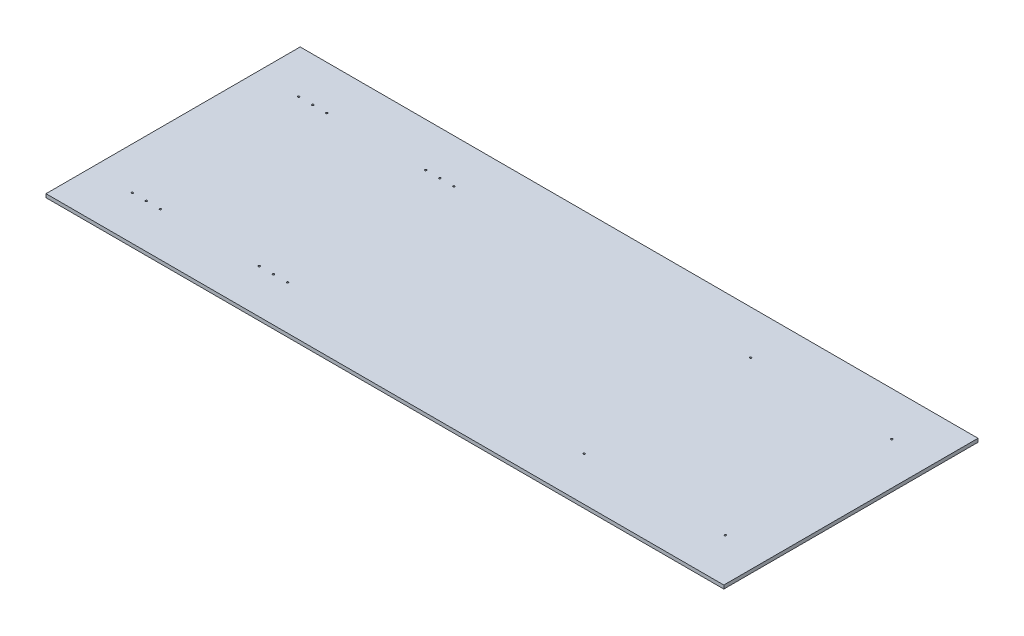
ISO-10303-21;
HEADER;
FILE_DESCRIPTION(('STEP AP214'),'2;1');
FILE_NAME('part.step','',(''),(''),'','','');
FILE_SCHEMA(('AUTOMOTIVE_DESIGN { 1 0 10303 214 1 1 1 1 }'));
ENDSEC;
DATA;
#1=APPLICATION_CONTEXT('core data for automotive mechanical design processes');
#2=APPLICATION_PROTOCOL_DEFINITION('international standard','automotive_design',2000,#1);
#3=PRODUCT_CONTEXT('',#1,'mechanical');
#4=PRODUCT('Part','Part','',(#3));
#5=PRODUCT_RELATED_PRODUCT_CATEGORY('part','',(#4));
#6=PRODUCT_DEFINITION_FORMATION('','',#4);
#7=PRODUCT_DEFINITION_CONTEXT('part definition',#1,'design');
#8=PRODUCT_DEFINITION('design','',#6,#7);
#9=PRODUCT_DEFINITION_SHAPE('','',#8);
#10=(LENGTH_UNIT() NAMED_UNIT(*) SI_UNIT(.MILLI.,.METRE.));
#11=(NAMED_UNIT(*) PLANE_ANGLE_UNIT() SI_UNIT($,.RADIAN.));
#12=(NAMED_UNIT(*) SI_UNIT($,.STERADIAN.) SOLID_ANGLE_UNIT());
#13=UNCERTAINTY_MEASURE_WITH_UNIT(LENGTH_MEASURE(1.E-05),#10,'distance_accuracy_value','');
#14=(GEOMETRIC_REPRESENTATION_CONTEXT(3) GLOBAL_UNCERTAINTY_ASSIGNED_CONTEXT((#13)) GLOBAL_UNIT_ASSIGNED_CONTEXT((#10,
#11,#12)) REPRESENTATION_CONTEXT('',''));
#15=CARTESIAN_POINT('',(0.,0.,0.));
#16=DIRECTION('',(0.,0.,1.));
#17=DIRECTION('',(1.,0.,0.));
#18=AXIS2_PLACEMENT_3D('',#15,#16,#17);
#19=CARTESIAN_POINT('',(-69.6693001407312,6.35,-431.310979244188));
#20=DIRECTION('',(1.,0.,0.));
#21=DIRECTION('',(0.,0.,-1.));
#22=AXIS2_PLACEMENT_3D('',#19,#20,#21);
#23=PLANE('',#22);
#24=DIRECTION('',(0.,0.,1.));
#25=VECTOR('',#24,1.);
#26=CARTESIAN_POINT('',(-69.6693001407312,0.,-431.310979244188));
#27=LINE('',#26,#25);
#28=CARTESIAN_POINT('',(-69.6693001407312,0.,-431.310979244188));
#29=VERTEX_POINT('',#28);
#30=CARTESIAN_POINT('',(-69.6693001407311,0.,25.8890207558125));
#31=VERTEX_POINT('',#30);
#32=EDGE_CURVE('E115',#29,#31,#27,.T.);
#33=ORIENTED_EDGE('',*,*,#32,.T.);
#34=DIRECTION('',(0.,-1.,0.));
#35=VECTOR('',#34,1.);
#36=CARTESIAN_POINT('',(-69.6693001407311,6.35,25.8890207558125));
#37=LINE('',#36,#35);
#38=CARTESIAN_POINT('',(-69.6693001407311,6.35,25.8890207558125));
#39=VERTEX_POINT('',#38);
#40=EDGE_CURVE('E11',#39,#31,#37,.T.);
#41=ORIENTED_EDGE('',*,*,#40,.F.);
#42=DIRECTION('',(0.,0.,1.));
#43=VECTOR('',#42,1.);
#44=CARTESIAN_POINT('',(-69.6693001407312,6.35,-431.310979244188));
#45=LINE('',#44,#43);
#46=CARTESIAN_POINT('',(-69.6693001407312,6.35,-431.310979244188));
#47=VERTEX_POINT('',#46);
#48=EDGE_CURVE('E98',#47,#39,#45,.T.);
#49=ORIENTED_EDGE('',*,*,#48,.F.);
#50=DIRECTION('',(0.,-1.,0.));
#51=VECTOR('',#50,1.);
#52=CARTESIAN_POINT('',(-69.6693001407312,6.35,-431.310979244188));
#53=LINE('',#52,#51);
#54=EDGE_CURVE('E111',#47,#29,#53,.T.);
#55=ORIENTED_EDGE('',*,*,#54,.T.);
#56=EDGE_LOOP('',(#33,#41,#49,#55));
#57=FACE_BOUND('',#56,.T.);
#58=ADVANCED_FACE('F40',(#57),#23,.F.);
#59=CARTESIAN_POINT('',(-69.6693001407311,6.35,25.8890207558125));
#60=DIRECTION('',(0.,0.,-1.));
#61=DIRECTION('',(-1.,0.,0.));
#62=AXIS2_PLACEMENT_3D('',#59,#60,#61);
#63=PLANE('',#62);
#64=DIRECTION('',(1.,0.,0.));
#65=VECTOR('',#64,1.);
#66=CARTESIAN_POINT('',(-69.6693001407311,0.,25.8890207558125));
#67=LINE('',#66,#65);
#68=CARTESIAN_POINT('',(1149.53069985927,0.,25.8890207558125));
#69=VERTEX_POINT('',#68);
#70=EDGE_CURVE('E103',#31,#69,#67,.T.);
#71=ORIENTED_EDGE('',*,*,#70,.T.);
#72=DIRECTION('',(0.,-1.,0.));
#73=VECTOR('',#72,1.);
#74=CARTESIAN_POINT('',(1149.53069985927,6.35,25.8890207558125));
#75=LINE('',#74,#73);
#76=CARTESIAN_POINT('',(1149.53069985927,6.35,25.8890207558125));
#77=VERTEX_POINT('',#76);
#78=EDGE_CURVE('E49',#77,#69,#75,.T.);
#79=ORIENTED_EDGE('',*,*,#78,.F.);
#80=DIRECTION('',(1.,0.,0.));
#81=VECTOR('',#80,1.);
#82=CARTESIAN_POINT('',(-69.6693001407311,6.35,25.8890207558125));
#83=LINE('',#82,#81);
#84=EDGE_CURVE('E93',#39,#77,#83,.T.);
#85=ORIENTED_EDGE('',*,*,#84,.F.);
#86=ORIENTED_EDGE('',*,*,#40,.T.);
#87=EDGE_LOOP('',(#71,#79,#85,#86));
#88=FACE_BOUND('',#87,.T.);
#89=ADVANCED_FACE('F102',(#88),#63,.F.);
#90=CARTESIAN_POINT('',(1149.53069985927,6.35,-431.310979244188));
#91=DIRECTION('',(-1.,0.,0.));
#92=DIRECTION('',(0.,0.,1.));
#93=AXIS2_PLACEMENT_3D('',#90,#91,#92);
#94=PLANE('',#93);
#95=DIRECTION('',(0.,0.,-1.));
#96=VECTOR('',#95,1.);
#97=CARTESIAN_POINT('',(1149.53069985927,0.,-431.310979244188));
#98=LINE('',#97,#96);
#99=CARTESIAN_POINT('',(1149.53069985927,0.,-431.310979244188));
#100=VERTEX_POINT('',#99);
#101=EDGE_CURVE('E78',#69,#100,#98,.T.);
#102=ORIENTED_EDGE('',*,*,#101,.T.);
#103=DIRECTION('',(0.,-1.,0.));
#104=VECTOR('',#103,1.);
#105=CARTESIAN_POINT('',(1149.53069985927,6.35,-431.310979244188));
#106=LINE('',#105,#104);
#107=CARTESIAN_POINT('',(1149.53069985927,6.35,-431.310979244188));
#108=VERTEX_POINT('',#107);
#109=EDGE_CURVE('E105',#108,#100,#106,.T.);
#110=ORIENTED_EDGE('',*,*,#109,.F.);
#111=DIRECTION('',(0.,0.,-1.));
#112=VECTOR('',#111,1.);
#113=CARTESIAN_POINT('',(1149.53069985927,6.35,-431.310979244188));
#114=LINE('',#113,#112);
#115=EDGE_CURVE('E96',#77,#108,#114,.T.);
#116=ORIENTED_EDGE('',*,*,#115,.F.);
#117=ORIENTED_EDGE('',*,*,#78,.T.);
#118=EDGE_LOOP('',(#102,#110,#116,#117));
#119=FACE_BOUND('',#118,.T.);
#120=ADVANCED_FACE('F106',(#119),#94,.F.);
#121=CARTESIAN_POINT('',(-69.6693001407312,6.35,-431.310979244188));
#122=DIRECTION('',(0.,0.,1.));
#123=DIRECTION('',(1.,0.,0.));
#124=AXIS2_PLACEMENT_3D('',#121,#122,#123);
#125=PLANE('',#124);
#126=DIRECTION('',(-1.,0.,0.));
#127=VECTOR('',#126,1.);
#128=CARTESIAN_POINT('',(-69.6693001407312,0.,-431.310979244188));
#129=LINE('',#128,#127);
#130=EDGE_CURVE('E86',#100,#29,#129,.T.);
#131=ORIENTED_EDGE('',*,*,#130,.T.);
#132=ORIENTED_EDGE('',*,*,#54,.F.);
#133=DIRECTION('',(-1.,0.,0.));
#134=VECTOR('',#133,1.);
#135=CARTESIAN_POINT('',(-69.6693001407312,6.35,-431.310979244188));
#136=LINE('',#135,#134);
#137=EDGE_CURVE('E59',#108,#47,#136,.T.);
#138=ORIENTED_EDGE('',*,*,#137,.F.);
#139=ORIENTED_EDGE('',*,*,#109,.T.);
#140=EDGE_LOOP('',(#131,#132,#138,#139));
#141=FACE_BOUND('',#140,.T.);
#142=ADVANCED_FACE('F128',(#141),#125,.F.);
#143=CARTESIAN_POINT('',(0.,6.35,0.));
#144=DIRECTION('',(0.,1.,0.));
#145=DIRECTION('',(0.,0.,1.));
#146=AXIS2_PLACEMENT_3D('',#143,#144,#145);
#147=PLANE('',#146);
#148=CARTESIAN_POINT('',(31.9306998592688,6.34999999999999,-53.0541792441876));
#149=DIRECTION('',(0.,-1.,0.));
#150=DIRECTION('',(0.,0.,-1.));
#151=AXIS2_PLACEMENT_3D('',#148,#149,#150);
#152=CIRCLE('',#151,1.63194999999999);
#153=CARTESIAN_POINT('',(31.9306998592688,6.34999999999999,-54.6861292441876));
#154=VERTEX_POINT('',#153);
#155=EDGE_CURVE('E313',#154,#154,#152,.T.);
#156=ORIENTED_EDGE('',*,*,#155,.T.);
#157=EDGE_LOOP('',(#156));
#158=FACE_BOUND('',#157,.T.);
#159=CARTESIAN_POINT('',(57.3306998592688,6.34999999999999,-53.0541792441876));
#160=DIRECTION('',(0.,-1.,0.));
#161=DIRECTION('',(0.,0.,-1.));
#162=AXIS2_PLACEMENT_3D('',#159,#160,#161);
#163=CIRCLE('',#162,1.63194999999999);
#164=CARTESIAN_POINT('',(57.3306998592688,6.34999999999999,-54.6861292441876));
#165=VERTEX_POINT('',#164);
#166=EDGE_CURVE('E301',#165,#165,#163,.T.);
#167=ORIENTED_EDGE('',*,*,#166,.T.);
#168=EDGE_LOOP('',(#167));
#169=FACE_BOUND('',#168,.T.);
#170=CARTESIAN_POINT('',(260.464546847095,6.35,-53.0541792441876));
#171=DIRECTION('',(0.,-1.,0.));
#172=DIRECTION('',(0.,0.,-1.));
#173=AXIS2_PLACEMENT_3D('',#170,#171,#172);
#174=CIRCLE('',#173,1.63194999999999);
#175=CARTESIAN_POINT('',(260.464546847095,6.35,-54.6861292441876));
#176=VERTEX_POINT('',#175);
#177=EDGE_CURVE('E289',#176,#176,#174,.T.);
#178=ORIENTED_EDGE('',*,*,#177,.T.);
#179=EDGE_LOOP('',(#178));
#180=FACE_BOUND('',#179,.T.);
#181=CARTESIAN_POINT('',(285.864546847095,6.35,-53.0541792441876));
#182=DIRECTION('',(0.,-1.,0.));
#183=DIRECTION('',(0.,0.,-1.));
#184=AXIS2_PLACEMENT_3D('',#181,#182,#183);
#185=CIRCLE('',#184,1.63194999999999);
#186=CARTESIAN_POINT('',(285.864546847095,6.35,-54.6861292441876));
#187=VERTEX_POINT('',#186);
#188=EDGE_CURVE('E277',#187,#187,#185,.T.);
#189=ORIENTED_EDGE('',*,*,#188,.T.);
#190=EDGE_LOOP('',(#189));
#191=FACE_BOUND('',#190,.T.);
#192=CARTESIAN_POINT('',(260.464546847095,6.35,-352.367779244188));
#193=DIRECTION('',(0.,-1.,0.));
#194=DIRECTION('',(0.,0.,-1.));
#195=AXIS2_PLACEMENT_3D('',#192,#193,#194);
#196=CIRCLE('',#195,1.63194999999999);
#197=CARTESIAN_POINT('',(260.464546847095,6.35,-353.999729244188));
#198=VERTEX_POINT('',#197);
#199=EDGE_CURVE('E265',#198,#198,#196,.T.);
#200=ORIENTED_EDGE('',*,*,#199,.T.);
#201=EDGE_LOOP('',(#200));
#202=FACE_BOUND('',#201,.T.);
#203=CARTESIAN_POINT('',(285.864546847095,6.35,-352.367779244188));
#204=DIRECTION('',(0.,-1.,0.));
#205=DIRECTION('',(0.,0.,-1.));
#206=AXIS2_PLACEMENT_3D('',#203,#204,#205);
#207=CIRCLE('',#206,1.63194999999999);
#208=CARTESIAN_POINT('',(285.864546847095,6.35,-353.999729244188));
#209=VERTEX_POINT('',#208);
#210=EDGE_CURVE('E253',#209,#209,#207,.T.);
#211=ORIENTED_EDGE('',*,*,#210,.T.);
#212=EDGE_LOOP('',(#211));
#213=FACE_BOUND('',#212,.T.);
#214=CARTESIAN_POINT('',(31.9306998592688,6.34999999999999,-352.367779244188));
#215=DIRECTION('',(0.,-1.,0.));
#216=DIRECTION('',(0.,0.,-1.));
#217=AXIS2_PLACEMENT_3D('',#214,#215,#216);
#218=CIRCLE('',#217,1.63194999999999);
#219=CARTESIAN_POINT('',(31.9306998592688,6.34999999999999,-353.999729244188));
#220=VERTEX_POINT('',#219);
#221=EDGE_CURVE('E241',#220,#220,#218,.T.);
#222=ORIENTED_EDGE('',*,*,#221,.T.);
#223=EDGE_LOOP('',(#222));
#224=FACE_BOUND('',#223,.T.);
#225=CARTESIAN_POINT('',(57.3306998592688,6.34999999999999,-352.367779244188));
#226=DIRECTION('',(0.,-1.,0.));
#227=DIRECTION('',(0.,0.,-1.));
#228=AXIS2_PLACEMENT_3D('',#225,#226,#227);
#229=CIRCLE('',#228,1.63194999999999);
#230=CARTESIAN_POINT('',(57.3306998592688,6.34999999999999,-353.999729244188));
#231=VERTEX_POINT('',#230);
#232=EDGE_CURVE('E230',#231,#231,#229,.T.);
#233=ORIENTED_EDGE('',*,*,#232,.T.);
#234=EDGE_LOOP('',(#233));
#235=FACE_BOUND('',#234,.T.);
#236=CARTESIAN_POINT('',(1073.33069985927,6.34999999999999,-53.0541792441876));
#237=DIRECTION('',(0.,-1.,0.));
#238=DIRECTION('',(0.,0.,-1.));
#239=AXIS2_PLACEMENT_3D('',#236,#237,#238);
#240=CIRCLE('',#239,1.63194999999994);
#241=CARTESIAN_POINT('',(1073.33069985927,6.34999999999999,-54.6861292441875));
#242=VERTEX_POINT('',#241);
#243=EDGE_CURVE('E219',#242,#242,#240,.T.);
#244=ORIENTED_EDGE('',*,*,#243,.T.);
#245=EDGE_LOOP('',(#244));
#246=FACE_BOUND('',#245,.T.);
#247=CARTESIAN_POINT('',(1073.33069985927,6.34999999999999,-352.367779244188));
#248=DIRECTION('',(0.,-1.,0.));
#249=DIRECTION('',(0.,0.,-1.));
#250=AXIS2_PLACEMENT_3D('',#247,#248,#249);
#251=CIRCLE('',#250,1.63194999999994);
#252=CARTESIAN_POINT('',(1073.33069985927,6.34999999999999,-353.999729244188));
#253=VERTEX_POINT('',#252);
#254=EDGE_CURVE('E207',#253,#253,#251,.T.);
#255=ORIENTED_EDGE('',*,*,#254,.T.);
#256=EDGE_LOOP('',(#255));
#257=FACE_BOUND('',#256,.T.);
#258=CARTESIAN_POINT('',(819.391763197748,6.34999999999999,-352.367779244188));
#259=DIRECTION('',(0.,-1.,0.));
#260=DIRECTION('',(0.,0.,-1.));
#261=AXIS2_PLACEMENT_3D('',#258,#259,#260);
#262=CIRCLE('',#261,1.63194999999994);
#263=CARTESIAN_POINT('',(819.391763197748,6.34999999999999,-353.999729244188));
#264=VERTEX_POINT('',#263);
#265=EDGE_CURVE('E195',#264,#264,#262,.T.);
#266=ORIENTED_EDGE('',*,*,#265,.T.);
#267=EDGE_LOOP('',(#266));
#268=FACE_BOUND('',#267,.T.);
#269=CARTESIAN_POINT('',(819.391763197748,6.34999999999999,-53.0541792441876));
#270=DIRECTION('',(0.,-1.,0.));
#271=DIRECTION('',(0.,0.,-1.));
#272=AXIS2_PLACEMENT_3D('',#269,#270,#271);
#273=CIRCLE('',#272,1.63194999999994);
#274=CARTESIAN_POINT('',(819.391763197748,6.34999999999999,-54.6861292441875));
#275=VERTEX_POINT('',#274);
#276=EDGE_CURVE('E183',#275,#275,#273,.T.);
#277=ORIENTED_EDGE('',*,*,#276,.T.);
#278=EDGE_LOOP('',(#277));
#279=FACE_BOUND('',#278,.T.);
#280=CARTESIAN_POINT('',(6.53069985926881,6.34999999999999,-53.0541792441876));
#281=DIRECTION('',(0.,-1.,0.));
#282=DIRECTION('',(0.,0.,-1.));
#283=AXIS2_PLACEMENT_3D('',#280,#281,#282);
#284=CIRCLE('',#283,1.63194999999999);
#285=CARTESIAN_POINT('',(6.53069985926881,6.34999999999999,-54.6861292441876));
#286=VERTEX_POINT('',#285);
#287=EDGE_CURVE('E171',#286,#286,#284,.T.);
#288=ORIENTED_EDGE('',*,*,#287,.T.);
#289=EDGE_LOOP('',(#288));
#290=FACE_BOUND('',#289,.T.);
#291=CARTESIAN_POINT('',(235.064546847095,6.34999999999999,-53.0541792441876));
#292=DIRECTION('',(0.,-1.,0.));
#293=DIRECTION('',(0.,0.,-1.));
#294=AXIS2_PLACEMENT_3D('',#291,#292,#293);
#295=CIRCLE('',#294,1.63194999999999);
#296=CARTESIAN_POINT('',(235.064546847095,6.34999999999999,-54.6861292441876));
#297=VERTEX_POINT('',#296);
#298=EDGE_CURVE('E159',#297,#297,#295,.T.);
#299=ORIENTED_EDGE('',*,*,#298,.T.);
#300=EDGE_LOOP('',(#299));
#301=FACE_BOUND('',#300,.T.);
#302=CARTESIAN_POINT('',(235.064546847095,6.34999999999999,-352.367779244188));
#303=DIRECTION('',(0.,-1.,0.));
#304=DIRECTION('',(0.,0.,-1.));
#305=AXIS2_PLACEMENT_3D('',#302,#303,#304);
#306=CIRCLE('',#305,1.63194999999999);
#307=CARTESIAN_POINT('',(235.064546847095,6.34999999999999,-353.999729244188));
#308=VERTEX_POINT('',#307);
#309=EDGE_CURVE('E147',#308,#308,#306,.T.);
#310=ORIENTED_EDGE('',*,*,#309,.T.);
#311=EDGE_LOOP('',(#310));
#312=FACE_BOUND('',#311,.T.);
#313=CARTESIAN_POINT('',(6.53069985926881,6.34999999999999,-352.367779244188));
#314=DIRECTION('',(0.,-1.,0.));
#315=DIRECTION('',(0.,0.,-1.));
#316=AXIS2_PLACEMENT_3D('',#313,#314,#315);
#317=CIRCLE('',#316,1.63194999999999);
#318=CARTESIAN_POINT('',(6.53069985926881,6.34999999999999,-353.999729244188));
#319=VERTEX_POINT('',#318);
#320=EDGE_CURVE('E119',#319,#319,#317,.T.);
#321=ORIENTED_EDGE('',*,*,#320,.T.);
#322=EDGE_LOOP('',(#321));
#323=FACE_BOUND('',#322,.T.);
#324=ORIENTED_EDGE('',*,*,#48,.T.);
#325=ORIENTED_EDGE('',*,*,#84,.T.);
#326=ORIENTED_EDGE('',*,*,#115,.T.);
#327=ORIENTED_EDGE('',*,*,#137,.T.);
#328=EDGE_LOOP('',(#324,#325,#326,#327));
#329=FACE_BOUND('',#328,.T.);
#330=ADVANCED_FACE('F94',(#158,#169,#180,#191,#202,#213,#224,#235,#246,#257,#268,#279,#290,#301,
#312,#323,#329),#147,.T.);
#331=CARTESIAN_POINT('',(0.,0.,0.));
#332=DIRECTION('',(0.,1.,0.));
#333=DIRECTION('',(0.,0.,1.));
#334=AXIS2_PLACEMENT_3D('',#331,#332,#333);
#335=PLANE('',#334);
#336=CARTESIAN_POINT('',(31.9306998592688,0.,-53.0541792441876));
#337=DIRECTION('',(0.,-1.,0.));
#338=DIRECTION('',(0.,0.,-1.));
#339=AXIS2_PLACEMENT_3D('',#336,#337,#338);
#340=CIRCLE('',#339,2.8575);
#341=CARTESIAN_POINT('',(31.9306998592688,0.,-55.9116792441876));
#342=VERTEX_POINT('',#341);
#343=EDGE_CURVE('E321',#342,#342,#340,.T.);
#344=ORIENTED_EDGE('',*,*,#343,.F.);
#345=EDGE_LOOP('',(#344));
#346=FACE_BOUND('',#345,.T.);
#347=CARTESIAN_POINT('',(57.3306998592688,0.,-53.0541792441876));
#348=DIRECTION('',(0.,-1.,0.));
#349=DIRECTION('',(0.,0.,-1.));
#350=AXIS2_PLACEMENT_3D('',#347,#348,#349);
#351=CIRCLE('',#350,2.8575);
#352=CARTESIAN_POINT('',(57.3306998592688,0.,-55.9116792441876));
#353=VERTEX_POINT('',#352);
#354=EDGE_CURVE('E309',#353,#353,#351,.T.);
#355=ORIENTED_EDGE('',*,*,#354,.F.);
#356=EDGE_LOOP('',(#355));
#357=FACE_BOUND('',#356,.T.);
#358=CARTESIAN_POINT('',(260.464546847095,0.,-53.0541792441876));
#359=DIRECTION('',(0.,-1.,0.));
#360=DIRECTION('',(0.,0.,-1.));
#361=AXIS2_PLACEMENT_3D('',#358,#359,#360);
#362=CIRCLE('',#361,2.85750000000001);
#363=CARTESIAN_POINT('',(260.464546847095,0.,-55.9116792441876));
#364=VERTEX_POINT('',#363);
#365=EDGE_CURVE('E297',#364,#364,#362,.T.);
#366=ORIENTED_EDGE('',*,*,#365,.F.);
#367=EDGE_LOOP('',(#366));
#368=FACE_BOUND('',#367,.T.);
#369=CARTESIAN_POINT('',(285.864546847095,0.,-53.0541792441876));
#370=DIRECTION('',(0.,-1.,0.));
#371=DIRECTION('',(0.,0.,-1.));
#372=AXIS2_PLACEMENT_3D('',#369,#370,#371);
#373=CIRCLE('',#372,2.85750000000001);
#374=CARTESIAN_POINT('',(285.864546847095,0.,-55.9116792441876));
#375=VERTEX_POINT('',#374);
#376=EDGE_CURVE('E285',#375,#375,#373,.T.);
#377=ORIENTED_EDGE('',*,*,#376,.F.);
#378=EDGE_LOOP('',(#377));
#379=FACE_BOUND('',#378,.T.);
#380=CARTESIAN_POINT('',(260.464546847095,0.,-352.367779244188));
#381=DIRECTION('',(0.,-1.,0.));
#382=DIRECTION('',(0.,0.,-1.));
#383=AXIS2_PLACEMENT_3D('',#380,#381,#382);
#384=CIRCLE('',#383,2.85750000000001);
#385=CARTESIAN_POINT('',(260.464546847095,0.,-355.225279244188));
#386=VERTEX_POINT('',#385);
#387=EDGE_CURVE('E273',#386,#386,#384,.T.);
#388=ORIENTED_EDGE('',*,*,#387,.F.);
#389=EDGE_LOOP('',(#388));
#390=FACE_BOUND('',#389,.T.);
#391=CARTESIAN_POINT('',(285.864546847095,0.,-352.367779244188));
#392=DIRECTION('',(0.,-1.,0.));
#393=DIRECTION('',(0.,0.,-1.));
#394=AXIS2_PLACEMENT_3D('',#391,#392,#393);
#395=CIRCLE('',#394,2.85750000000001);
#396=CARTESIAN_POINT('',(285.864546847095,0.,-355.225279244188));
#397=VERTEX_POINT('',#396);
#398=EDGE_CURVE('E261',#397,#397,#395,.T.);
#399=ORIENTED_EDGE('',*,*,#398,.F.);
#400=EDGE_LOOP('',(#399));
#401=FACE_BOUND('',#400,.T.);
#402=CARTESIAN_POINT('',(31.9306998592688,0.,-352.367779244188));
#403=DIRECTION('',(0.,-1.,0.));
#404=DIRECTION('',(0.,0.,-1.));
#405=AXIS2_PLACEMENT_3D('',#402,#403,#404);
#406=CIRCLE('',#405,2.8575);
#407=CARTESIAN_POINT('',(31.9306998592688,0.,-355.225279244188));
#408=VERTEX_POINT('',#407);
#409=EDGE_CURVE('E249',#408,#408,#406,.T.);
#410=ORIENTED_EDGE('',*,*,#409,.F.);
#411=EDGE_LOOP('',(#410));
#412=FACE_BOUND('',#411,.T.);
#413=CARTESIAN_POINT('',(57.3306998592688,0.,-352.367779244188));
#414=DIRECTION('',(0.,-1.,0.));
#415=DIRECTION('',(0.,0.,-1.));
#416=AXIS2_PLACEMENT_3D('',#413,#414,#415);
#417=CIRCLE('',#416,2.8575);
#418=CARTESIAN_POINT('',(57.3306998592688,0.,-355.225279244188));
#419=VERTEX_POINT('',#418);
#420=EDGE_CURVE('E237',#419,#419,#417,.T.);
#421=ORIENTED_EDGE('',*,*,#420,.F.);
#422=EDGE_LOOP('',(#421));
#423=FACE_BOUND('',#422,.T.);
#424=CARTESIAN_POINT('',(1073.33069985927,0.,-53.0541792441876));
#425=DIRECTION('',(0.,-1.,0.));
#426=DIRECTION('',(0.,0.,-1.));
#427=AXIS2_PLACEMENT_3D('',#424,#425,#426);
#428=CIRCLE('',#427,2.85749999999996);
#429=CARTESIAN_POINT('',(1073.33069985927,0.,-55.9116792441875));
#430=VERTEX_POINT('',#429);
#431=EDGE_CURVE('E227',#430,#430,#428,.T.);
#432=ORIENTED_EDGE('',*,*,#431,.F.);
#433=EDGE_LOOP('',(#432));
#434=FACE_BOUND('',#433,.T.);
#435=CARTESIAN_POINT('',(1073.33069985927,0.,-352.367779244188));
#436=DIRECTION('',(0.,-1.,0.));
#437=DIRECTION('',(0.,0.,-1.));
#438=AXIS2_PLACEMENT_3D('',#435,#436,#437);
#439=CIRCLE('',#438,2.85749999999996);
#440=CARTESIAN_POINT('',(1073.33069985927,0.,-355.225279244188));
#441=VERTEX_POINT('',#440);
#442=EDGE_CURVE('E215',#441,#441,#439,.T.);
#443=ORIENTED_EDGE('',*,*,#442,.F.);
#444=EDGE_LOOP('',(#443));
#445=FACE_BOUND('',#444,.T.);
#446=CARTESIAN_POINT('',(819.391763197748,0.,-352.367779244188));
#447=DIRECTION('',(0.,-1.,0.));
#448=DIRECTION('',(0.,0.,-1.));
#449=AXIS2_PLACEMENT_3D('',#446,#447,#448);
#450=CIRCLE('',#449,2.85749999999996);
#451=CARTESIAN_POINT('',(819.391763197748,0.,-355.225279244188));
#452=VERTEX_POINT('',#451);
#453=EDGE_CURVE('E203',#452,#452,#450,.T.);
#454=ORIENTED_EDGE('',*,*,#453,.F.);
#455=EDGE_LOOP('',(#454));
#456=FACE_BOUND('',#455,.T.);
#457=CARTESIAN_POINT('',(819.391763197748,0.,-53.0541792441876));
#458=DIRECTION('',(0.,-1.,0.));
#459=DIRECTION('',(0.,0.,-1.));
#460=AXIS2_PLACEMENT_3D('',#457,#458,#459);
#461=CIRCLE('',#460,2.85749999999996);
#462=CARTESIAN_POINT('',(819.391763197748,0.,-55.9116792441875));
#463=VERTEX_POINT('',#462);
#464=EDGE_CURVE('E191',#463,#463,#461,.T.);
#465=ORIENTED_EDGE('',*,*,#464,.F.);
#466=EDGE_LOOP('',(#465));
#467=FACE_BOUND('',#466,.T.);
#468=CARTESIAN_POINT('',(6.53069985926881,0.,-53.0541792441876));
#469=DIRECTION('',(0.,-1.,0.));
#470=DIRECTION('',(0.,0.,-1.));
#471=AXIS2_PLACEMENT_3D('',#468,#469,#470);
#472=CIRCLE('',#471,2.8575);
#473=CARTESIAN_POINT('',(6.53069985926881,0.,-55.9116792441876));
#474=VERTEX_POINT('',#473);
#475=EDGE_CURVE('E179',#474,#474,#472,.T.);
#476=ORIENTED_EDGE('',*,*,#475,.F.);
#477=EDGE_LOOP('',(#476));
#478=FACE_BOUND('',#477,.T.);
#479=CARTESIAN_POINT('',(235.064546847095,0.,-53.0541792441876));
#480=DIRECTION('',(0.,-1.,0.));
#481=DIRECTION('',(0.,0.,-1.));
#482=AXIS2_PLACEMENT_3D('',#479,#480,#481);
#483=CIRCLE('',#482,2.85750000000001);
#484=CARTESIAN_POINT('',(235.064546847095,0.,-55.9116792441876));
#485=VERTEX_POINT('',#484);
#486=EDGE_CURVE('E167',#485,#485,#483,.T.);
#487=ORIENTED_EDGE('',*,*,#486,.F.);
#488=EDGE_LOOP('',(#487));
#489=FACE_BOUND('',#488,.T.);
#490=CARTESIAN_POINT('',(235.064546847095,0.,-352.367779244188));
#491=DIRECTION('',(0.,-1.,0.));
#492=DIRECTION('',(0.,0.,-1.));
#493=AXIS2_PLACEMENT_3D('',#490,#491,#492);
#494=CIRCLE('',#493,2.85750000000001);
#495=CARTESIAN_POINT('',(235.064546847095,0.,-355.225279244188));
#496=VERTEX_POINT('',#495);
#497=EDGE_CURVE('E155',#496,#496,#494,.T.);
#498=ORIENTED_EDGE('',*,*,#497,.F.);
#499=EDGE_LOOP('',(#498));
#500=FACE_BOUND('',#499,.T.);
#501=CARTESIAN_POINT('',(6.53069985926881,0.,-352.367779244188));
#502=DIRECTION('',(0.,-1.,0.));
#503=DIRECTION('',(0.,0.,-1.));
#504=AXIS2_PLACEMENT_3D('',#501,#502,#503);
#505=CIRCLE('',#504,2.8575);
#506=CARTESIAN_POINT('',(6.53069985926881,0.,-355.225279244188));
#507=VERTEX_POINT('',#506);
#508=EDGE_CURVE('E143',#507,#507,#505,.T.);
#509=ORIENTED_EDGE('',*,*,#508,.F.);
#510=EDGE_LOOP('',(#509));
#511=FACE_BOUND('',#510,.T.);
#512=ORIENTED_EDGE('',*,*,#32,.F.);
#513=ORIENTED_EDGE('',*,*,#130,.F.);
#514=ORIENTED_EDGE('',*,*,#101,.F.);
#515=ORIENTED_EDGE('',*,*,#70,.F.);
#516=EDGE_LOOP('',(#512,#513,#514,#515));
#517=FACE_BOUND('',#516,.T.);
#518=ADVANCED_FACE('F131',(#346,#357,#368,#379,#390,#401,#412,#423,#434,#445,#456,#467,#478,
#489,#500,#511,#517),#335,.F.);
#519=CARTESIAN_POINT('',(6.53069985926881,0.,-352.367779244188));
#520=DIRECTION('',(0.,-1.,0.));
#521=DIRECTION('',(0.,0.,-1.));
#522=AXIS2_PLACEMENT_3D('',#519,#520,#521);
#523=CYLINDRICAL_SURFACE('',#522,1.63194999999999);
#524=ORIENTED_EDGE('',*,*,#320,.F.);
#525=EDGE_LOOP('',(#524));
#526=FACE_BOUND('',#525,.T.);
#527=CARTESIAN_POINT('',(6.53069985926881,1.40983400146974,-352.367779244188));
#528=DIRECTION('',(0.,-1.,0.));
#529=DIRECTION('',(0.,0.,-1.));
#530=AXIS2_PLACEMENT_3D('',#527,#528,#529);
#531=CIRCLE('',#530,1.63194999999999);
#532=CARTESIAN_POINT('',(6.53069985926881,1.40983400146974,-353.999729244188));
#533=VERTEX_POINT('',#532);
#534=EDGE_CURVE('E139',#533,#533,#531,.T.);
#535=ORIENTED_EDGE('',*,*,#534,.T.);
#536=EDGE_LOOP('',(#535));
#537=FACE_BOUND('',#536,.T.);
#538=ADVANCED_FACE('F330',(#526,#537),#523,.F.);
#539=CARTESIAN_POINT('',(6.53069985926881,0.,-352.367779244188));
#540=DIRECTION('',(0.,-1.,0.));
#541=DIRECTION('',(0.,0.,-1.));
#542=AXIS2_PLACEMENT_3D('',#539,#540,#541);
#543=CONICAL_SURFACE('',#542,2.8575,0.715584993317668);
#544=ORIENTED_EDGE('',*,*,#534,.F.);
#545=EDGE_LOOP('',(#544));
#546=FACE_BOUND('',#545,.T.);
#547=ORIENTED_EDGE('',*,*,#508,.T.);
#548=EDGE_LOOP('',(#547));
#549=FACE_BOUND('',#548,.T.);
#550=ADVANCED_FACE('F362',(#546,#549),#543,.F.);
#551=CARTESIAN_POINT('',(235.064546847095,0.,-352.367779244188));
#552=DIRECTION('',(0.,-1.,0.));
#553=DIRECTION('',(0.,0.,-1.));
#554=AXIS2_PLACEMENT_3D('',#551,#552,#553);
#555=CYLINDRICAL_SURFACE('',#554,1.63194999999999);
#556=ORIENTED_EDGE('',*,*,#309,.F.);
#557=EDGE_LOOP('',(#556));
#558=FACE_BOUND('',#557,.T.);
#559=CARTESIAN_POINT('',(235.064546847095,1.40983400146974,-352.367779244188));
#560=DIRECTION('',(0.,-1.,0.));
#561=DIRECTION('',(0.,0.,-1.));
#562=AXIS2_PLACEMENT_3D('',#559,#560,#561);
#563=CIRCLE('',#562,1.63194999999999);
#564=CARTESIAN_POINT('',(235.064546847095,1.40983400146974,-353.999729244188));
#565=VERTEX_POINT('',#564);
#566=EDGE_CURVE('E151',#565,#565,#563,.T.);
#567=ORIENTED_EDGE('',*,*,#566,.T.);
#568=EDGE_LOOP('',(#567));
#569=FACE_BOUND('',#568,.T.);
#570=ADVANCED_FACE('F364',(#558,#569),#555,.F.);
#571=CARTESIAN_POINT('',(235.064546847095,0.,-352.367779244188));
#572=DIRECTION('',(0.,-1.,0.));
#573=DIRECTION('',(0.,0.,-1.));
#574=AXIS2_PLACEMENT_3D('',#571,#572,#573);
#575=CONICAL_SURFACE('',#574,2.85750000000001,0.715584993317671);
#576=ORIENTED_EDGE('',*,*,#566,.F.);
#577=EDGE_LOOP('',(#576));
#578=FACE_BOUND('',#577,.T.);
#579=ORIENTED_EDGE('',*,*,#497,.T.);
#580=EDGE_LOOP('',(#579));
#581=FACE_BOUND('',#580,.T.);
#582=ADVANCED_FACE('F371',(#578,#581),#575,.F.);
#583=CARTESIAN_POINT('',(235.064546847095,0.,-53.0541792441876));
#584=DIRECTION('',(0.,-1.,0.));
#585=DIRECTION('',(0.,0.,-1.));
#586=AXIS2_PLACEMENT_3D('',#583,#584,#585);
#587=CYLINDRICAL_SURFACE('',#586,1.63194999999999);
#588=ORIENTED_EDGE('',*,*,#298,.F.);
#589=EDGE_LOOP('',(#588));
#590=FACE_BOUND('',#589,.T.);
#591=CARTESIAN_POINT('',(235.064546847095,1.40983400146974,-53.0541792441876));
#592=DIRECTION('',(0.,-1.,0.));
#593=DIRECTION('',(0.,0.,-1.));
#594=AXIS2_PLACEMENT_3D('',#591,#592,#593);
#595=CIRCLE('',#594,1.63194999999999);
#596=CARTESIAN_POINT('',(235.064546847095,1.40983400146974,-54.6861292441876));
#597=VERTEX_POINT('',#596);
#598=EDGE_CURVE('E163',#597,#597,#595,.T.);
#599=ORIENTED_EDGE('',*,*,#598,.T.);
#600=EDGE_LOOP('',(#599));
#601=FACE_BOUND('',#600,.T.);
#602=ADVANCED_FACE('F428',(#590,#601),#587,.F.);
#603=CARTESIAN_POINT('',(235.064546847095,0.,-53.0541792441876));
#604=DIRECTION('',(0.,-1.,0.));
#605=DIRECTION('',(0.,0.,-1.));
#606=AXIS2_PLACEMENT_3D('',#603,#604,#605);
#607=CONICAL_SURFACE('',#606,2.85750000000001,0.715584993317671);
#608=ORIENTED_EDGE('',*,*,#598,.F.);
#609=EDGE_LOOP('',(#608));
#610=FACE_BOUND('',#609,.T.);
#611=ORIENTED_EDGE('',*,*,#486,.T.);
#612=EDGE_LOOP('',(#611));
#613=FACE_BOUND('',#612,.T.);
#614=ADVANCED_FACE('F433',(#610,#613),#607,.F.);
#615=CARTESIAN_POINT('',(6.53069985926881,0.,-53.0541792441876));
#616=DIRECTION('',(0.,-1.,0.));
#617=DIRECTION('',(0.,0.,-1.));
#618=AXIS2_PLACEMENT_3D('',#615,#616,#617);
#619=CYLINDRICAL_SURFACE('',#618,1.63194999999999);
#620=ORIENTED_EDGE('',*,*,#287,.F.);
#621=EDGE_LOOP('',(#620));
#622=FACE_BOUND('',#621,.T.);
#623=CARTESIAN_POINT('',(6.53069985926881,1.40983400146974,-53.0541792441876));
#624=DIRECTION('',(0.,-1.,0.));
#625=DIRECTION('',(0.,0.,-1.));
#626=AXIS2_PLACEMENT_3D('',#623,#624,#625);
#627=CIRCLE('',#626,1.63194999999999);
#628=CARTESIAN_POINT('',(6.53069985926881,1.40983400146974,-54.6861292441876));
#629=VERTEX_POINT('',#628);
#630=EDGE_CURVE('E175',#629,#629,#627,.T.);
#631=ORIENTED_EDGE('',*,*,#630,.T.);
#632=EDGE_LOOP('',(#631));
#633=FACE_BOUND('',#632,.T.);
#634=ADVANCED_FACE('F439',(#622,#633),#619,.F.);
#635=CARTESIAN_POINT('',(6.53069985926881,0.,-53.0541792441876));
#636=DIRECTION('',(0.,-1.,0.));
#637=DIRECTION('',(0.,0.,-1.));
#638=AXIS2_PLACEMENT_3D('',#635,#636,#637);
#639=CONICAL_SURFACE('',#638,2.8575,0.715584993317668);
#640=ORIENTED_EDGE('',*,*,#630,.F.);
#641=EDGE_LOOP('',(#640));
#642=FACE_BOUND('',#641,.T.);
#643=ORIENTED_EDGE('',*,*,#475,.T.);
#644=EDGE_LOOP('',(#643));
#645=FACE_BOUND('',#644,.T.);
#646=ADVANCED_FACE('F443',(#642,#645),#639,.F.);
#647=CARTESIAN_POINT('',(819.391763197748,0.,-53.0541792441876));
#648=DIRECTION('',(0.,-1.,0.));
#649=DIRECTION('',(0.,0.,-1.));
#650=AXIS2_PLACEMENT_3D('',#647,#648,#649);
#651=CYLINDRICAL_SURFACE('',#650,1.63194999999994);
#652=ORIENTED_EDGE('',*,*,#276,.F.);
#653=EDGE_LOOP('',(#652));
#654=FACE_BOUND('',#653,.T.);
#655=CARTESIAN_POINT('',(819.391763197748,1.40983400146974,-53.0541792441876));
#656=DIRECTION('',(0.,-1.,0.));
#657=DIRECTION('',(0.,0.,-1.));
#658=AXIS2_PLACEMENT_3D('',#655,#656,#657);
#659=CIRCLE('',#658,1.63194999999994);
#660=CARTESIAN_POINT('',(819.391763197748,1.40983400146974,-54.6861292441875));
#661=VERTEX_POINT('',#660);
#662=EDGE_CURVE('E187',#661,#661,#659,.T.);
#663=ORIENTED_EDGE('',*,*,#662,.T.);
#664=EDGE_LOOP('',(#663));
#665=FACE_BOUND('',#664,.T.);
#666=ADVANCED_FACE('F447',(#654,#665),#651,.F.);
#667=CARTESIAN_POINT('',(819.391763197748,0.,-53.0541792441876));
#668=DIRECTION('',(0.,-1.,0.));
#669=DIRECTION('',(0.,0.,-1.));
#670=AXIS2_PLACEMENT_3D('',#667,#668,#669);
#671=CONICAL_SURFACE('',#670,2.85749999999996,0.715584993317671);
#672=ORIENTED_EDGE('',*,*,#662,.F.);
#673=EDGE_LOOP('',(#672));
#674=FACE_BOUND('',#673,.T.);
#675=ORIENTED_EDGE('',*,*,#464,.T.);
#676=EDGE_LOOP('',(#675));
#677=FACE_BOUND('',#676,.T.);
#678=ADVANCED_FACE('F451',(#674,#677),#671,.F.);
#679=CARTESIAN_POINT('',(819.391763197748,0.,-352.367779244188));
#680=DIRECTION('',(0.,-1.,0.));
#681=DIRECTION('',(0.,0.,-1.));
#682=AXIS2_PLACEMENT_3D('',#679,#680,#681);
#683=CYLINDRICAL_SURFACE('',#682,1.63194999999994);
#684=ORIENTED_EDGE('',*,*,#265,.F.);
#685=EDGE_LOOP('',(#684));
#686=FACE_BOUND('',#685,.T.);
#687=CARTESIAN_POINT('',(819.391763197748,1.40983400146974,-352.367779244188));
#688=DIRECTION('',(0.,-1.,0.));
#689=DIRECTION('',(0.,0.,-1.));
#690=AXIS2_PLACEMENT_3D('',#687,#688,#689);
#691=CIRCLE('',#690,1.63194999999994);
#692=CARTESIAN_POINT('',(819.391763197748,1.40983400146974,-353.999729244188));
#693=VERTEX_POINT('',#692);
#694=EDGE_CURVE('E199',#693,#693,#691,.T.);
#695=ORIENTED_EDGE('',*,*,#694,.T.);
#696=EDGE_LOOP('',(#695));
#697=FACE_BOUND('',#696,.T.);
#698=ADVANCED_FACE('F455',(#686,#697),#683,.F.);
#699=CARTESIAN_POINT('',(819.391763197748,0.,-352.367779244188));
#700=DIRECTION('',(0.,-1.,0.));
#701=DIRECTION('',(0.,0.,-1.));
#702=AXIS2_PLACEMENT_3D('',#699,#700,#701);
#703=CONICAL_SURFACE('',#702,2.85749999999996,0.715584993317671);
#704=ORIENTED_EDGE('',*,*,#694,.F.);
#705=EDGE_LOOP('',(#704));
#706=FACE_BOUND('',#705,.T.);
#707=ORIENTED_EDGE('',*,*,#453,.T.);
#708=EDGE_LOOP('',(#707));
#709=FACE_BOUND('',#708,.T.);
#710=ADVANCED_FACE('F459',(#706,#709),#703,.F.);
#711=CARTESIAN_POINT('',(1073.33069985927,0.,-352.367779244188));
#712=DIRECTION('',(0.,-1.,0.));
#713=DIRECTION('',(0.,0.,-1.));
#714=AXIS2_PLACEMENT_3D('',#711,#712,#713);
#715=CYLINDRICAL_SURFACE('',#714,1.63194999999994);
#716=ORIENTED_EDGE('',*,*,#254,.F.);
#717=EDGE_LOOP('',(#716));
#718=FACE_BOUND('',#717,.T.);
#719=CARTESIAN_POINT('',(1073.33069985927,1.40983400146974,-352.367779244188));
#720=DIRECTION('',(0.,-1.,0.));
#721=DIRECTION('',(0.,0.,-1.));
#722=AXIS2_PLACEMENT_3D('',#719,#720,#721);
#723=CIRCLE('',#722,1.63194999999994);
#724=CARTESIAN_POINT('',(1073.33069985927,1.40983400146974,-353.999729244188));
#725=VERTEX_POINT('',#724);
#726=EDGE_CURVE('E211',#725,#725,#723,.T.);
#727=ORIENTED_EDGE('',*,*,#726,.T.);
#728=EDGE_LOOP('',(#727));
#729=FACE_BOUND('',#728,.T.);
#730=ADVANCED_FACE('F463',(#718,#729),#715,.F.);
#731=CARTESIAN_POINT('',(1073.33069985927,0.,-352.367779244188));
#732=DIRECTION('',(0.,-1.,0.));
#733=DIRECTION('',(0.,0.,-1.));
#734=AXIS2_PLACEMENT_3D('',#731,#732,#733);
#735=CONICAL_SURFACE('',#734,2.85749999999996,0.715584993317671);
#736=ORIENTED_EDGE('',*,*,#726,.F.);
#737=EDGE_LOOP('',(#736));
#738=FACE_BOUND('',#737,.T.);
#739=ORIENTED_EDGE('',*,*,#442,.T.);
#740=EDGE_LOOP('',(#739));
#741=FACE_BOUND('',#740,.T.);
#742=ADVANCED_FACE('F467',(#738,#741),#735,.F.);
#743=CARTESIAN_POINT('',(1073.33069985927,0.,-53.0541792441876));
#744=DIRECTION('',(0.,-1.,0.));
#745=DIRECTION('',(0.,0.,-1.));
#746=AXIS2_PLACEMENT_3D('',#743,#744,#745);
#747=CYLINDRICAL_SURFACE('',#746,1.63194999999994);
#748=ORIENTED_EDGE('',*,*,#243,.F.);
#749=EDGE_LOOP('',(#748));
#750=FACE_BOUND('',#749,.T.);
#751=CARTESIAN_POINT('',(1073.33069985927,1.40983400146974,-53.0541792441876));
#752=DIRECTION('',(0.,-1.,0.));
#753=DIRECTION('',(0.,0.,-1.));
#754=AXIS2_PLACEMENT_3D('',#751,#752,#753);
#755=CIRCLE('',#754,1.63194999999994);
#756=CARTESIAN_POINT('',(1073.33069985927,1.40983400146974,-54.6861292441875));
#757=VERTEX_POINT('',#756);
#758=EDGE_CURVE('E223',#757,#757,#755,.T.);
#759=ORIENTED_EDGE('',*,*,#758,.T.);
#760=EDGE_LOOP('',(#759));
#761=FACE_BOUND('',#760,.T.);
#762=ADVANCED_FACE('F471',(#750,#761),#747,.F.);
#763=CARTESIAN_POINT('',(1073.33069985927,0.,-53.0541792441876));
#764=DIRECTION('',(0.,-1.,0.));
#765=DIRECTION('',(0.,0.,-1.));
#766=AXIS2_PLACEMENT_3D('',#763,#764,#765);
#767=CONICAL_SURFACE('',#766,2.85749999999996,0.715584993317671);
#768=ORIENTED_EDGE('',*,*,#758,.F.);
#769=EDGE_LOOP('',(#768));
#770=FACE_BOUND('',#769,.T.);
#771=ORIENTED_EDGE('',*,*,#431,.T.);
#772=EDGE_LOOP('',(#771));
#773=FACE_BOUND('',#772,.T.);
#774=ADVANCED_FACE('F475',(#770,#773),#767,.F.);
#775=CARTESIAN_POINT('',(57.3306998592688,0.,-352.367779244188));
#776=DIRECTION('',(0.,-1.,0.));
#777=DIRECTION('',(0.,0.,-1.));
#778=AXIS2_PLACEMENT_3D('',#775,#776,#777);
#779=CYLINDRICAL_SURFACE('',#778,1.63194999999999);
#780=ORIENTED_EDGE('',*,*,#232,.F.);
#781=EDGE_LOOP('',(#780));
#782=FACE_BOUND('',#781,.T.);
#783=CARTESIAN_POINT('',(57.3306998592688,1.40983400146974,-352.367779244188));
#784=DIRECTION('',(0.,-1.,0.));
#785=DIRECTION('',(0.,0.,-1.));
#786=AXIS2_PLACEMENT_3D('',#783,#784,#785);
#787=CIRCLE('',#786,1.63194999999999);
#788=CARTESIAN_POINT('',(57.3306998592688,1.40983400146974,-353.999729244188));
#789=VERTEX_POINT('',#788);
#790=EDGE_CURVE('E233',#789,#789,#787,.T.);
#791=ORIENTED_EDGE('',*,*,#790,.T.);
#792=EDGE_LOOP('',(#791));
#793=FACE_BOUND('',#792,.T.);
#794=ADVANCED_FACE('F479',(#782,#793),#779,.F.);
#795=CARTESIAN_POINT('',(57.3306998592688,0.,-352.367779244188));
#796=DIRECTION('',(0.,-1.,0.));
#797=DIRECTION('',(0.,0.,-1.));
#798=AXIS2_PLACEMENT_3D('',#795,#796,#797);
#799=CONICAL_SURFACE('',#798,2.8575,0.715584993317669);
#800=ORIENTED_EDGE('',*,*,#790,.F.);
#801=EDGE_LOOP('',(#800));
#802=FACE_BOUND('',#801,.T.);
#803=ORIENTED_EDGE('',*,*,#420,.T.);
#804=EDGE_LOOP('',(#803));
#805=FACE_BOUND('',#804,.T.);
#806=ADVANCED_FACE('F483',(#802,#805),#799,.F.);
#807=CARTESIAN_POINT('',(31.9306998592688,0.,-352.367779244188));
#808=DIRECTION('',(0.,-1.,0.));
#809=DIRECTION('',(0.,0.,-1.));
#810=AXIS2_PLACEMENT_3D('',#807,#808,#809);
#811=CYLINDRICAL_SURFACE('',#810,1.63194999999999);
#812=ORIENTED_EDGE('',*,*,#221,.F.);
#813=EDGE_LOOP('',(#812));
#814=FACE_BOUND('',#813,.T.);
#815=CARTESIAN_POINT('',(31.9306998592688,1.40983400146974,-352.367779244188));
#816=DIRECTION('',(0.,-1.,0.));
#817=DIRECTION('',(0.,0.,-1.));
#818=AXIS2_PLACEMENT_3D('',#815,#816,#817);
#819=CIRCLE('',#818,1.63194999999999);
#820=CARTESIAN_POINT('',(31.9306998592688,1.40983400146974,-353.999729244188));
#821=VERTEX_POINT('',#820);
#822=EDGE_CURVE('E245',#821,#821,#819,.T.);
#823=ORIENTED_EDGE('',*,*,#822,.T.);
#824=EDGE_LOOP('',(#823));
#825=FACE_BOUND('',#824,.T.);
#826=ADVANCED_FACE('F487',(#814,#825),#811,.F.);
#827=CARTESIAN_POINT('',(31.9306998592688,0.,-352.367779244188));
#828=DIRECTION('',(0.,-1.,0.));
#829=DIRECTION('',(0.,0.,-1.));
#830=AXIS2_PLACEMENT_3D('',#827,#828,#829);
#831=CONICAL_SURFACE('',#830,2.8575,0.715584993317669);
#832=ORIENTED_EDGE('',*,*,#822,.F.);
#833=EDGE_LOOP('',(#832));
#834=FACE_BOUND('',#833,.T.);
#835=ORIENTED_EDGE('',*,*,#409,.T.);
#836=EDGE_LOOP('',(#835));
#837=FACE_BOUND('',#836,.T.);
#838=ADVANCED_FACE('F491',(#834,#837),#831,.F.);
#839=CARTESIAN_POINT('',(285.864546847095,0.,-352.367779244188));
#840=DIRECTION('',(0.,-1.,0.));
#841=DIRECTION('',(0.,0.,-1.));
#842=AXIS2_PLACEMENT_3D('',#839,#840,#841);
#843=CYLINDRICAL_SURFACE('',#842,1.63194999999999);
#844=ORIENTED_EDGE('',*,*,#210,.F.);
#845=EDGE_LOOP('',(#844));
#846=FACE_BOUND('',#845,.T.);
#847=CARTESIAN_POINT('',(285.864546847095,1.40983400146974,-352.367779244188));
#848=DIRECTION('',(0.,-1.,0.));
#849=DIRECTION('',(0.,0.,-1.));
#850=AXIS2_PLACEMENT_3D('',#847,#848,#849);
#851=CIRCLE('',#850,1.63194999999999);
#852=CARTESIAN_POINT('',(285.864546847095,1.40983400146974,-353.999729244188));
#853=VERTEX_POINT('',#852);
#854=EDGE_CURVE('E257',#853,#853,#851,.T.);
#855=ORIENTED_EDGE('',*,*,#854,.T.);
#856=EDGE_LOOP('',(#855));
#857=FACE_BOUND('',#856,.T.);
#858=ADVANCED_FACE('F495',(#846,#857),#843,.F.);
#859=CARTESIAN_POINT('',(285.864546847095,0.,-352.367779244188));
#860=DIRECTION('',(0.,-1.,0.));
#861=DIRECTION('',(0.,0.,-1.));
#862=AXIS2_PLACEMENT_3D('',#859,#860,#861);
#863=CONICAL_SURFACE('',#862,2.85750000000001,0.715584993317671);
#864=ORIENTED_EDGE('',*,*,#854,.F.);
#865=EDGE_LOOP('',(#864));
#866=FACE_BOUND('',#865,.T.);
#867=ORIENTED_EDGE('',*,*,#398,.T.);
#868=EDGE_LOOP('',(#867));
#869=FACE_BOUND('',#868,.T.);
#870=ADVANCED_FACE('F499',(#866,#869),#863,.F.);
#871=CARTESIAN_POINT('',(260.464546847095,0.,-352.367779244188));
#872=DIRECTION('',(0.,-1.,0.));
#873=DIRECTION('',(0.,0.,-1.));
#874=AXIS2_PLACEMENT_3D('',#871,#872,#873);
#875=CYLINDRICAL_SURFACE('',#874,1.63194999999999);
#876=ORIENTED_EDGE('',*,*,#199,.F.);
#877=EDGE_LOOP('',(#876));
#878=FACE_BOUND('',#877,.T.);
#879=CARTESIAN_POINT('',(260.464546847095,1.40983400146974,-352.367779244188));
#880=DIRECTION('',(0.,-1.,0.));
#881=DIRECTION('',(0.,0.,-1.));
#882=AXIS2_PLACEMENT_3D('',#879,#880,#881);
#883=CIRCLE('',#882,1.63194999999999);
#884=CARTESIAN_POINT('',(260.464546847095,1.40983400146974,-353.999729244188));
#885=VERTEX_POINT('',#884);
#886=EDGE_CURVE('E269',#885,#885,#883,.T.);
#887=ORIENTED_EDGE('',*,*,#886,.T.);
#888=EDGE_LOOP('',(#887));
#889=FACE_BOUND('',#888,.T.);
#890=ADVANCED_FACE('F503',(#878,#889),#875,.F.);
#891=CARTESIAN_POINT('',(260.464546847095,0.,-352.367779244188));
#892=DIRECTION('',(0.,-1.,0.));
#893=DIRECTION('',(0.,0.,-1.));
#894=AXIS2_PLACEMENT_3D('',#891,#892,#893);
#895=CONICAL_SURFACE('',#894,2.85750000000001,0.715584993317671);
#896=ORIENTED_EDGE('',*,*,#886,.F.);
#897=EDGE_LOOP('',(#896));
#898=FACE_BOUND('',#897,.T.);
#899=ORIENTED_EDGE('',*,*,#387,.T.);
#900=EDGE_LOOP('',(#899));
#901=FACE_BOUND('',#900,.T.);
#902=ADVANCED_FACE('F507',(#898,#901),#895,.F.);
#903=CARTESIAN_POINT('',(285.864546847095,0.,-53.0541792441876));
#904=DIRECTION('',(0.,-1.,0.));
#905=DIRECTION('',(0.,0.,-1.));
#906=AXIS2_PLACEMENT_3D('',#903,#904,#905);
#907=CYLINDRICAL_SURFACE('',#906,1.63194999999999);
#908=ORIENTED_EDGE('',*,*,#188,.F.);
#909=EDGE_LOOP('',(#908));
#910=FACE_BOUND('',#909,.T.);
#911=CARTESIAN_POINT('',(285.864546847095,1.40983400146974,-53.0541792441876));
#912=DIRECTION('',(0.,-1.,0.));
#913=DIRECTION('',(0.,0.,-1.));
#914=AXIS2_PLACEMENT_3D('',#911,#912,#913);
#915=CIRCLE('',#914,1.63194999999999);
#916=CARTESIAN_POINT('',(285.864546847095,1.40983400146974,-54.6861292441876));
#917=VERTEX_POINT('',#916);
#918=EDGE_CURVE('E281',#917,#917,#915,.T.);
#919=ORIENTED_EDGE('',*,*,#918,.T.);
#920=EDGE_LOOP('',(#919));
#921=FACE_BOUND('',#920,.T.);
#922=ADVANCED_FACE('F511',(#910,#921),#907,.F.);
#923=CARTESIAN_POINT('',(285.864546847095,0.,-53.0541792441876));
#924=DIRECTION('',(0.,-1.,0.));
#925=DIRECTION('',(0.,0.,-1.));
#926=AXIS2_PLACEMENT_3D('',#923,#924,#925);
#927=CONICAL_SURFACE('',#926,2.85750000000001,0.715584993317671);
#928=ORIENTED_EDGE('',*,*,#918,.F.);
#929=EDGE_LOOP('',(#928));
#930=FACE_BOUND('',#929,.T.);
#931=ORIENTED_EDGE('',*,*,#376,.T.);
#932=EDGE_LOOP('',(#931));
#933=FACE_BOUND('',#932,.T.);
#934=ADVANCED_FACE('F515',(#930,#933),#927,.F.);
#935=CARTESIAN_POINT('',(260.464546847095,0.,-53.0541792441876));
#936=DIRECTION('',(0.,-1.,0.));
#937=DIRECTION('',(0.,0.,-1.));
#938=AXIS2_PLACEMENT_3D('',#935,#936,#937);
#939=CYLINDRICAL_SURFACE('',#938,1.63194999999999);
#940=ORIENTED_EDGE('',*,*,#177,.F.);
#941=EDGE_LOOP('',(#940));
#942=FACE_BOUND('',#941,.T.);
#943=CARTESIAN_POINT('',(260.464546847095,1.40983400146974,-53.0541792441876));
#944=DIRECTION('',(0.,-1.,0.));
#945=DIRECTION('',(0.,0.,-1.));
#946=AXIS2_PLACEMENT_3D('',#943,#944,#945);
#947=CIRCLE('',#946,1.63194999999999);
#948=CARTESIAN_POINT('',(260.464546847095,1.40983400146974,-54.6861292441876));
#949=VERTEX_POINT('',#948);
#950=EDGE_CURVE('E293',#949,#949,#947,.T.);
#951=ORIENTED_EDGE('',*,*,#950,.T.);
#952=EDGE_LOOP('',(#951));
#953=FACE_BOUND('',#952,.T.);
#954=ADVANCED_FACE('F519',(#942,#953),#939,.F.);
#955=CARTESIAN_POINT('',(260.464546847095,0.,-53.0541792441876));
#956=DIRECTION('',(0.,-1.,0.));
#957=DIRECTION('',(0.,0.,-1.));
#958=AXIS2_PLACEMENT_3D('',#955,#956,#957);
#959=CONICAL_SURFACE('',#958,2.85750000000001,0.715584993317671);
#960=ORIENTED_EDGE('',*,*,#950,.F.);
#961=EDGE_LOOP('',(#960));
#962=FACE_BOUND('',#961,.T.);
#963=ORIENTED_EDGE('',*,*,#365,.T.);
#964=EDGE_LOOP('',(#963));
#965=FACE_BOUND('',#964,.T.);
#966=ADVANCED_FACE('F523',(#962,#965),#959,.F.);
#967=CARTESIAN_POINT('',(57.3306998592688,0.,-53.0541792441876));
#968=DIRECTION('',(0.,-1.,0.));
#969=DIRECTION('',(0.,0.,-1.));
#970=AXIS2_PLACEMENT_3D('',#967,#968,#969);
#971=CYLINDRICAL_SURFACE('',#970,1.63194999999999);
#972=ORIENTED_EDGE('',*,*,#166,.F.);
#973=EDGE_LOOP('',(#972));
#974=FACE_BOUND('',#973,.T.);
#975=CARTESIAN_POINT('',(57.3306998592688,1.40983400146974,-53.0541792441876));
#976=DIRECTION('',(0.,-1.,0.));
#977=DIRECTION('',(0.,0.,-1.));
#978=AXIS2_PLACEMENT_3D('',#975,#976,#977);
#979=CIRCLE('',#978,1.63194999999999);
#980=CARTESIAN_POINT('',(57.3306998592688,1.40983400146974,-54.6861292441876));
#981=VERTEX_POINT('',#980);
#982=EDGE_CURVE('E305',#981,#981,#979,.T.);
#983=ORIENTED_EDGE('',*,*,#982,.T.);
#984=EDGE_LOOP('',(#983));
#985=FACE_BOUND('',#984,.T.);
#986=ADVANCED_FACE('F527',(#974,#985),#971,.F.);
#987=CARTESIAN_POINT('',(57.3306998592688,0.,-53.0541792441876));
#988=DIRECTION('',(0.,-1.,0.));
#989=DIRECTION('',(0.,0.,-1.));
#990=AXIS2_PLACEMENT_3D('',#987,#988,#989);
#991=CONICAL_SURFACE('',#990,2.8575,0.715584993317669);
#992=ORIENTED_EDGE('',*,*,#982,.F.);
#993=EDGE_LOOP('',(#992));
#994=FACE_BOUND('',#993,.T.);
#995=ORIENTED_EDGE('',*,*,#354,.T.);
#996=EDGE_LOOP('',(#995));
#997=FACE_BOUND('',#996,.T.);
#998=ADVANCED_FACE('F531',(#994,#997),#991,.F.);
#999=CARTESIAN_POINT('',(31.9306998592688,0.,-53.0541792441876));
#1000=DIRECTION('',(0.,-1.,0.));
#1001=DIRECTION('',(0.,0.,-1.));
#1002=AXIS2_PLACEMENT_3D('',#999,#1000,#1001);
#1003=CYLINDRICAL_SURFACE('',#1002,1.63194999999999);
#1004=ORIENTED_EDGE('',*,*,#155,.F.);
#1005=EDGE_LOOP('',(#1004));
#1006=FACE_BOUND('',#1005,.T.);
#1007=CARTESIAN_POINT('',(31.9306998592688,1.40983400146974,-53.0541792441876));
#1008=DIRECTION('',(0.,-1.,0.));
#1009=DIRECTION('',(0.,0.,-1.));
#1010=AXIS2_PLACEMENT_3D('',#1007,#1008,#1009);
#1011=CIRCLE('',#1010,1.63194999999999);
#1012=CARTESIAN_POINT('',(31.9306998592688,1.40983400146974,-54.6861292441876));
#1013=VERTEX_POINT('',#1012);
#1014=EDGE_CURVE('E317',#1013,#1013,#1011,.T.);
#1015=ORIENTED_EDGE('',*,*,#1014,.T.);
#1016=EDGE_LOOP('',(#1015));
#1017=FACE_BOUND('',#1016,.T.);
#1018=ADVANCED_FACE('F535',(#1006,#1017),#1003,.F.);
#1019=CARTESIAN_POINT('',(31.9306998592688,0.,-53.0541792441876));
#1020=DIRECTION('',(0.,-1.,0.));
#1021=DIRECTION('',(0.,0.,-1.));
#1022=AXIS2_PLACEMENT_3D('',#1019,#1020,#1021);
#1023=CONICAL_SURFACE('',#1022,2.8575,0.715584993317669);
#1024=ORIENTED_EDGE('',*,*,#1014,.F.);
#1025=EDGE_LOOP('',(#1024));
#1026=FACE_BOUND('',#1025,.T.);
#1027=ORIENTED_EDGE('',*,*,#343,.T.);
#1028=EDGE_LOOP('',(#1027));
#1029=FACE_BOUND('',#1028,.T.);
#1030=ADVANCED_FACE('F326',(#1026,#1029),#1023,.F.);
#1031=CLOSED_SHELL('',(#58,#89,#120,#142,#330,#518,#538,#550,#570,#582,#602,#614,#634,#646,#666,
#678,#698,#710,#730,#742,#762,#774,#794,#806,#826,#838,#858,#870,#890,#902,#922,#934,#954,#966,
#986,#998,#1018,#1030));
#1032=MANIFOLD_SOLID_BREP('B2',#1031);
#1033=ADVANCED_BREP_SHAPE_REPRESENTATION('',(#18,#1032),#14);
#1034=SHAPE_DEFINITION_REPRESENTATION(#9,#1033);
ENDSEC;
END-ISO-10303-21;
